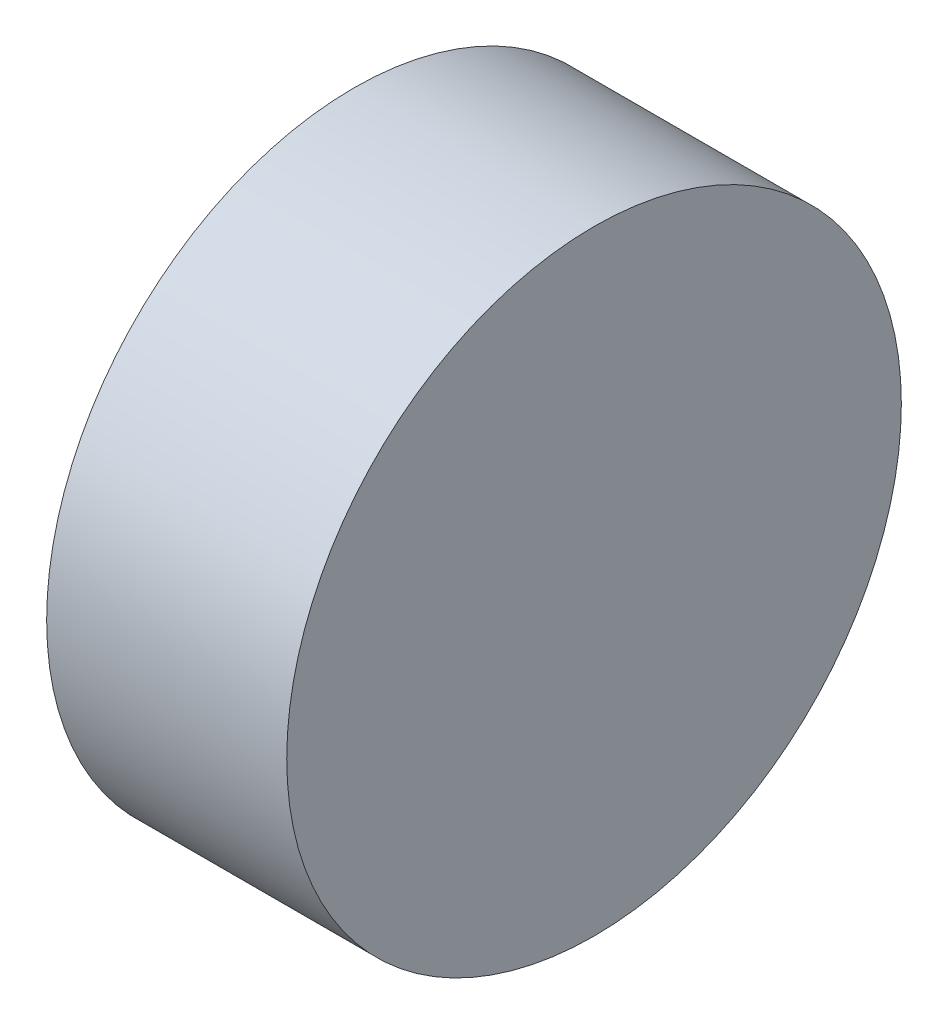
ISO-10303-21;
HEADER;
FILE_DESCRIPTION(('STEP AP214'),'2;1');
FILE_NAME('part.step','',(''),(''),'','','');
FILE_SCHEMA(('AUTOMOTIVE_DESIGN { 1 0 10303 214 1 1 1 1 }'));
ENDSEC;
DATA;
#1=APPLICATION_CONTEXT('core data for automotive mechanical design processes');
#2=APPLICATION_PROTOCOL_DEFINITION('international standard','automotive_design',2000,#1);
#3=PRODUCT_CONTEXT('',#1,'mechanical');
#4=PRODUCT('Part','Part','',(#3));
#5=PRODUCT_RELATED_PRODUCT_CATEGORY('part','',(#4));
#6=PRODUCT_DEFINITION_FORMATION('','',#4);
#7=PRODUCT_DEFINITION_CONTEXT('part definition',#1,'design');
#8=PRODUCT_DEFINITION('design','',#6,#7);
#9=PRODUCT_DEFINITION_SHAPE('','',#8);
#10=(LENGTH_UNIT() NAMED_UNIT(*) SI_UNIT(.MILLI.,.METRE.));
#11=(NAMED_UNIT(*) PLANE_ANGLE_UNIT() SI_UNIT($,.RADIAN.));
#12=(NAMED_UNIT(*) SI_UNIT($,.STERADIAN.) SOLID_ANGLE_UNIT());
#13=UNCERTAINTY_MEASURE_WITH_UNIT(LENGTH_MEASURE(1.E-05),#10,'distance_accuracy_value','');
#14=(GEOMETRIC_REPRESENTATION_CONTEXT(3) GLOBAL_UNCERTAINTY_ASSIGNED_CONTEXT((#13)) GLOBAL_UNIT_ASSIGNED_CONTEXT((#10,
#11,#12)) REPRESENTATION_CONTEXT('',''));
#15=CARTESIAN_POINT('',(0.,0.,0.));
#16=DIRECTION('',(0.,0.,1.));
#17=DIRECTION('',(1.,0.,0.));
#18=AXIS2_PLACEMENT_3D('',#15,#16,#17);
#19=CARTESIAN_POINT('',(-12.5,0.,0.));
#20=DIRECTION('',(1.,0.,0.));
#21=DIRECTION('',(0.,0.,-1.));
#22=AXIS2_PLACEMENT_3D('',#19,#20,#21);
#23=CYLINDRICAL_SURFACE('',#22,32.);
#24=CARTESIAN_POINT('',(-12.5,0.,0.));
#25=DIRECTION('',(1.,0.,0.));
#26=DIRECTION('',(0.,0.,-1.));
#27=AXIS2_PLACEMENT_3D('',#24,#25,#26);
#28=CIRCLE('',#27,32.);
#29=CARTESIAN_POINT('',(-12.5,0.,-32.));
#30=VERTEX_POINT('',#29);
#31=EDGE_CURVE('E10',#30,#30,#28,.T.);
#32=ORIENTED_EDGE('',*,*,#31,.T.);
#33=EDGE_LOOP('',(#32));
#34=FACE_BOUND('',#33,.T.);
#35=CARTESIAN_POINT('',(12.5,0.,0.));
#36=DIRECTION('',(1.,0.,0.));
#37=DIRECTION('',(0.,0.,-1.));
#38=AXIS2_PLACEMENT_3D('',#35,#36,#37);
#39=CIRCLE('',#38,32.);
#40=CARTESIAN_POINT('',(12.5,0.,-32.));
#41=VERTEX_POINT('',#40);
#42=EDGE_CURVE('E37',#41,#41,#39,.T.);
#43=ORIENTED_EDGE('',*,*,#42,.F.);
#44=EDGE_LOOP('',(#43));
#45=FACE_BOUND('',#44,.T.);
#46=ADVANCED_FACE('F31',(#34,#45),#23,.T.);
#47=CARTESIAN_POINT('',(-12.5,0.,0.));
#48=DIRECTION('',(1.,0.,0.));
#49=DIRECTION('',(0.,0.,-1.));
#50=AXIS2_PLACEMENT_3D('',#47,#48,#49);
#51=PLANE('',#50);
#52=ORIENTED_EDGE('',*,*,#31,.F.);
#53=EDGE_LOOP('',(#52));
#54=FACE_BOUND('',#53,.T.);
#55=ADVANCED_FACE('F46',(#54),#51,.F.);
#56=CARTESIAN_POINT('',(12.5,0.,0.));
#57=DIRECTION('',(1.,0.,0.));
#58=DIRECTION('',(0.,0.,-1.));
#59=AXIS2_PLACEMENT_3D('',#56,#57,#58);
#60=PLANE('',#59);
#61=ORIENTED_EDGE('',*,*,#42,.T.);
#62=EDGE_LOOP('',(#61));
#63=FACE_BOUND('',#62,.T.);
#64=ADVANCED_FACE('F43',(#63),#60,.T.);
#65=CLOSED_SHELL('',(#46,#55,#64));
#66=MANIFOLD_SOLID_BREP('B2',#65);
#67=ADVANCED_BREP_SHAPE_REPRESENTATION('',(#18,#66),#14);
#68=SHAPE_DEFINITION_REPRESENTATION(#9,#67);
ENDSEC;
END-ISO-10303-21;
